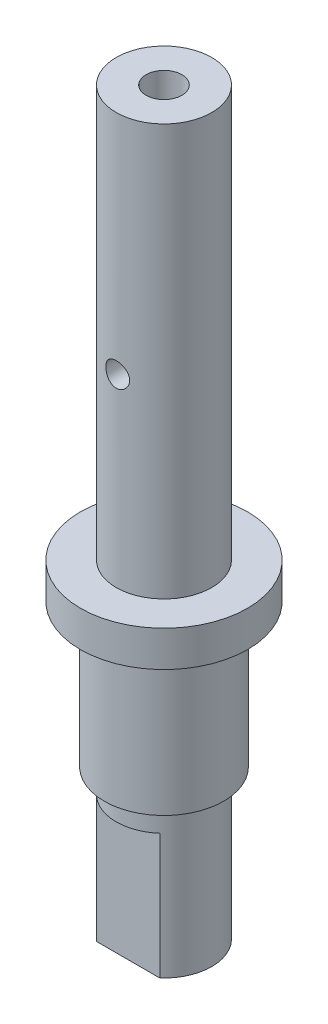
ISO-10303-21;
HEADER;
FILE_DESCRIPTION(('STEP AP214'),'2;1');
FILE_NAME('part.step','',(''),(''),'','','');
FILE_SCHEMA(('AUTOMOTIVE_DESIGN { 1 0 10303 214 1 1 1 1 }'));
ENDSEC;
DATA;
#1=APPLICATION_CONTEXT('core data for automotive mechanical design processes');
#2=APPLICATION_PROTOCOL_DEFINITION('international standard','automotive_design',2000,#1);
#3=PRODUCT_CONTEXT('',#1,'mechanical');
#4=PRODUCT('Part','Part','',(#3));
#5=PRODUCT_RELATED_PRODUCT_CATEGORY('part','',(#4));
#6=PRODUCT_DEFINITION_FORMATION('','',#4);
#7=PRODUCT_DEFINITION_CONTEXT('part definition',#1,'design');
#8=PRODUCT_DEFINITION('design','',#6,#7);
#9=PRODUCT_DEFINITION_SHAPE('','',#8);
#10=(LENGTH_UNIT() NAMED_UNIT(*) SI_UNIT(.MILLI.,.METRE.));
#11=(NAMED_UNIT(*) PLANE_ANGLE_UNIT() SI_UNIT($,.RADIAN.));
#12=(NAMED_UNIT(*) SI_UNIT($,.STERADIAN.) SOLID_ANGLE_UNIT());
#13=UNCERTAINTY_MEASURE_WITH_UNIT(LENGTH_MEASURE(1.E-05),#10,'distance_accuracy_value','');
#14=(GEOMETRIC_REPRESENTATION_CONTEXT(3) GLOBAL_UNCERTAINTY_ASSIGNED_CONTEXT((#13)) GLOBAL_UNIT_ASSIGNED_CONTEXT((#10,
#11,#12)) REPRESENTATION_CONTEXT('',''));
#15=CARTESIAN_POINT('',(0.,0.,0.));
#16=DIRECTION('',(0.,0.,1.));
#17=DIRECTION('',(1.,0.,0.));
#18=AXIS2_PLACEMENT_3D('',#15,#16,#17);
#19=CARTESIAN_POINT('',(0.,39.8,0.));
#20=DIRECTION('',(0.,-1.,0.));
#21=DIRECTION('',(0.,0.,-1.));
#22=AXIS2_PLACEMENT_3D('',#19,#20,#21);
#23=CYLINDRICAL_SURFACE('',#22,4.);
#24=CARTESIAN_POINT('',(0.,27.5,0.));
#25=DIRECTION('',(0.,1.,0.));
#26=DIRECTION('',(0.,0.,1.));
#27=AXIS2_PLACEMENT_3D('',#24,#25,#26);
#28=CIRCLE('',#27,4.);
#29=CARTESIAN_POINT('',(0.,27.5,4.));
#30=VERTEX_POINT('',#29);
#31=EDGE_CURVE('E74',#30,#30,#28,.T.);
#32=ORIENTED_EDGE('',*,*,#31,.T.);
#33=EDGE_LOOP('',(#32));
#34=FACE_BOUND('',#33,.T.);
#35=CARTESIAN_POINT('',(0.,61.963925,0.));
#36=DIRECTION('',(0.,1.,0.));
#37=DIRECTION('',(0.,0.,1.));
#38=AXIS2_PLACEMENT_3D('',#35,#36,#37);
#39=CIRCLE('',#38,4.);
#40=CARTESIAN_POINT('',(0.,61.963925,4.));
#41=VERTEX_POINT('',#40);
#42=EDGE_CURVE('E70',#41,#41,#39,.T.);
#43=ORIENTED_EDGE('',*,*,#42,.F.);
#44=EDGE_LOOP('',(#43));
#45=FACE_BOUND('',#44,.T.);
#46=CARTESIAN_POINT('',(-0.999999999999999,42.963925,3.87298334620742));
#47=CARTESIAN_POINT('',(-0.999998431438698,42.9087046996432,3.87298440057185));
#48=CARTESIAN_POINT('',(-0.995410498208068,42.8534670405686,3.87417722499278));
#49=CARTESIAN_POINT('',(-0.977209250194446,42.7445779687674,3.87880744892249));
#50=CARTESIAN_POINT('',(-0.963590682698078,42.69092749822,3.8822461547418));
#51=CARTESIAN_POINT('',(-0.927796479849635,42.5868035847122,3.89095489813012));
#52=CARTESIAN_POINT('',(-0.905631891140942,42.5363261378422,3.8962225706936));
#53=CARTESIAN_POINT('',(-0.853408456505405,42.4398006589875,3.90799276818327));
#54=CARTESIAN_POINT('',(-0.823349275424504,42.3937528151688,3.91449534553241));
#55=CARTESIAN_POINT('',(-0.755483370924518,42.3063803418942,3.92816286540368));
#56=CARTESIAN_POINT('',(-0.717534755081559,42.2651675598597,3.93533839048709));
#57=CARTESIAN_POINT('',(-0.635272825640329,42.1896204422561,3.94945150206622));
#58=CARTESIAN_POINT('',(-0.590958917672139,42.1552867497514,3.95638906626691));
#59=CARTESIAN_POINT('',(-0.496458080431564,42.0940148129474,3.96936166208095));
#60=CARTESIAN_POINT('',(-0.446197830478043,42.0671864447354,3.975382749602));
#61=CARTESIAN_POINT('',(-0.34170527371711,42.0224011423388,3.9857232477043));
#62=CARTESIAN_POINT('',(-0.287473554316778,42.0044428992338,3.99004290933747));
#63=CARTESIAN_POINT('',(-0.177743503501665,41.9782658661686,3.99641903539262));
#64=CARTESIAN_POINT('',(-0.122293087819592,41.9698571422694,3.99851957537723));
#65=CARTESIAN_POINT('',(-0.0107315277051112,41.9624216482898,4.00037437642922));
#66=CARTESIAN_POINT('',(0.0453795178152241,41.9633934911162,4.00012898438682));
#67=CARTESIAN_POINT('',(0.155352247172384,41.9745549401001,3.99735237981413));
#68=CARTESIAN_POINT('',(0.209236215601063,41.9845395300215,3.99487200936349));
#69=CARTESIAN_POINT('',(0.314538247413683,42.0131135080194,3.98796334609942));
#70=CARTESIAN_POINT('',(0.365956179370436,42.031703354151,3.98353494959376));
#71=CARTESIAN_POINT('',(0.465406703501805,42.0771260282748,3.97315003880358));
#72=CARTESIAN_POINT('',(0.513404509766502,42.1040318178647,3.96718007878021));
#73=CARTESIAN_POINT('',(0.604275622340485,42.1652672716465,3.9543596152386));
#74=CARTESIAN_POINT('',(0.647148035085503,42.1995982274242,3.94750895860996));
#75=CARTESIAN_POINT('',(0.727774035084955,42.2758084967929,3.93345485507808));
#76=CARTESIAN_POINT('',(0.765357679075198,42.3178669569391,3.92624687810367));
#77=CARTESIAN_POINT('',(0.832976375963017,42.4077649894161,3.91246017406682));
#78=CARTESIAN_POINT('',(0.863011076046014,42.4556048317964,3.90588147642388));
#79=CARTESIAN_POINT('',(0.914788129022598,42.5560410136596,3.89408198732659));
#80=CARTESIAN_POINT('',(0.936489566970494,42.6086592921253,3.88886793490288));
#81=CARTESIAN_POINT('',(0.970685620636344,42.7169591872306,3.88047456055983));
#82=CARTESIAN_POINT('',(0.983182206552912,42.7726401455933,3.87729480324087));
#83=CARTESIAN_POINT('',(0.998331855466071,42.8839088006092,3.87342142415656));
#84=CARTESIAN_POINT('',(1.00123618956785,42.9394601173318,3.87266435637459));
#85=CARTESIAN_POINT('',(0.99780679620622,43.0502537746313,3.87354937392416));
#86=CARTESIAN_POINT('',(0.991473919139522,43.1054961431805,3.87519123840506));
#87=CARTESIAN_POINT('',(0.969970185575067,43.2131707059819,3.88062832781824));
#88=CARTESIAN_POINT('',(0.9549456273127,43.2656340906283,3.8843878809375));
#89=CARTESIAN_POINT('',(0.91664723266825,43.3672975831407,3.89360287308385));
#90=CARTESIAN_POINT('',(0.893372419085019,43.4164973036221,3.89905851299445));
#91=CARTESIAN_POINT('',(0.838708267174625,43.5113015111469,3.91118454837305));
#92=CARTESIAN_POINT('',(0.807168701534254,43.5568165360172,3.91787667442657));
#93=CARTESIAN_POINT('',(0.737060292934457,43.6420003451205,3.93166833228686));
#94=CARTESIAN_POINT('',(0.698490294805439,43.68166816666,3.93876793091388));
#95=CARTESIAN_POINT('',(0.614262720984725,43.7550494170284,3.95278961212643));
#96=CARTESIAN_POINT('',(0.568451952531593,43.7885890250195,3.95970280824734));
#97=CARTESIAN_POINT('',(0.471702682694678,43.8474993467805,3.97238886645493));
#98=CARTESIAN_POINT('',(0.420764448957596,43.8728704866433,3.97816178801584));
#99=CARTESIAN_POINT('',(0.315558201731097,43.9145034138112,3.98788046295326));
#100=CARTESIAN_POINT('',(0.261317381027888,43.9308307137516,3.99183932008964));
#101=CARTESIAN_POINT('',(0.150749760318813,43.9541091338434,3.99754117358315));
#102=CARTESIAN_POINT('',(0.0944233650412474,43.9610620634956,3.99928459757363));
#103=CARTESIAN_POINT('',(-0.0170835264433233,43.9652925895755,4.00034169408811));
#104=CARTESIAN_POINT('',(-0.0722538269660297,43.9628267090954,3.99971978880008));
#105=CARTESIAN_POINT('',(-0.181367496414736,43.9488771727057,3.99625896457423));
#106=CARTESIAN_POINT('',(-0.235310901780882,43.9373937849869,3.99342011157094));
#107=CARTESIAN_POINT('',(-0.340171035644812,43.9058727802291,3.98585432853963));
#108=CARTESIAN_POINT('',(-0.391102494581015,43.8858815466854,3.98113764502669));
#109=CARTESIAN_POINT('',(-0.488917053041464,43.8379544209807,3.97031288913382));
#110=CARTESIAN_POINT('',(-0.535799641265047,43.8100175273304,3.96420464137727));
#111=CARTESIAN_POINT('',(-0.625401928423896,43.7462097660029,3.95107249681342));
#112=CARTESIAN_POINT('',(-0.667994988300582,43.7101648570926,3.94403016945647));
#113=CARTESIAN_POINT('',(-0.746615020271248,43.6315021480262,3.92990649053207));
#114=CARTESIAN_POINT('',(-0.782640325068175,43.5888826839021,3.92282512952424));
#115=CARTESIAN_POINT('',(-0.847762026479237,43.4973235857987,3.90927475860683));
#116=CARTESIAN_POINT('',(-0.876716619446589,43.4482808765875,3.90281963730391));
#117=CARTESIAN_POINT('',(-0.925926896615618,43.3458695100772,3.8914395555011));
#118=CARTESIAN_POINT('',(-0.946188909759554,43.2925040338927,3.88651348244814));
#119=CARTESIAN_POINT('',(-0.97442252856557,43.1933479881737,3.87951908741315));
#120=CARTESIAN_POINT('',(-0.983993170595827,43.1480318356176,3.87708663005761));
#121=CARTESIAN_POINT('',(-0.996782292572818,43.0564561309985,3.87381838580358));
#122=CARTESIAN_POINT('',(-1.00000131437052,43.0101966597494,3.87298246270639));
#123=CARTESIAN_POINT('',(-0.999999999999999,42.963925,3.87298334620742));
#124=B_SPLINE_CURVE_WITH_KNOTS('',3,(#46,#47,#48,#49,#50,#51,#52,#53,#54,#55,#56,#57,#58,#59,
#60,#61,#62,#63,#64,#65,#66,#67,#68,#69,#70,#71,#72,#73,#74,#75,#76,#77,#78,#79,#80,#81,#82,#83,
#84,#85,#86,#87,#88,#89,#90,#91,#92,#93,#94,#95,#96,#97,#98,#99,#100,#101,#102,#103,#104,#105,
#106,#107,#108,#109,#110,#111,#112,#113,#114,#115,#116,#117,#118,#119,#120,#121,#122,#123),
.UNSPECIFIED.,.T.,.F.,(4,2,2,2,2,2,2,2,2,2,2,2,2,2,2,2,2,2,2,2,2,2,2,2,2,2,2,2,2,2,2,2,2,2,2,2,
2,2,4),(0.,0.165490976675223,0.331078296534208,0.496452290829153,0.66183330698466,
0.830495816734646,0.999174085882211,1.17020598555442,1.34121263935111,1.50875500394413,
1.67627259462682,1.84007305071853,2.00388222686188,2.16917149698052,2.33448954183839,
2.50428186625039,2.67408212476195,2.84470572799636,3.01529280048094,3.18137429900961,
3.34744050869795,3.51078961999958,3.67415808564842,3.84073138339938,4.00733207550293,
4.17810132382402,4.34886166284095,4.51836829119046,4.6878421955989,4.85273378447257,
5.01762046947067,5.18161950620159,5.34563922291503,5.51358838629103,5.68158012622478,
5.85270590910145,6.02370688542922,6.16239130867207,6.30106390036083),.UNSPECIFIED.);
#125=CARTESIAN_POINT('',(-0.999999999999999,42.963925,3.87298334620742));
#126=VERTEX_POINT('',#125);
#127=EDGE_CURVE('E83',#126,#126,#124,.T.);
#128=ORIENTED_EDGE('',*,*,#127,.F.);
#129=EDGE_LOOP('',(#128));
#130=FACE_BOUND('',#129,.T.);
#131=CARTESIAN_POINT('',(0.,43.963925,-4.));
#132=CARTESIAN_POINT('',(0.055250725779821,43.9639234495079,-3.99999906578675));
#133=CARTESIAN_POINT('',(0.110518771887176,43.9593306328175,-3.99884385421219));
#134=CARTESIAN_POINT('',(0.219470882513689,43.941108232462,-3.99434742553261));
#135=CARTESIAN_POINT('',(0.27315403124716,43.9274735269748,-3.99100496946646));
#136=CARTESIAN_POINT('',(0.37734724812172,43.8916321643586,-3.98250417554693));
#137=CARTESIAN_POINT('',(0.427861042286672,43.8694358008565,-3.97734801894724));
#138=CARTESIAN_POINT('',(0.524448087936288,43.8171374066368,-3.96576895871729));
#139=CARTESIAN_POINT('',(0.570521189565842,43.787035109254,-3.95934601236034));
#140=CARTESIAN_POINT('',(0.657867951533948,43.7191244735639,-3.94578275727868));
#141=CARTESIAN_POINT('',(0.699037126707383,43.6811839500272,-3.93863138099022));
#142=CARTESIAN_POINT('',(0.774499284802205,43.5989568633941,-3.92449080078353));
#143=CARTESIAN_POINT('',(0.808791491299426,43.5546695847023,-3.91750161525566));
#144=CARTESIAN_POINT('',(0.870017695199358,43.4601948488417,-3.9043651713314));
#145=CARTESIAN_POINT('',(0.896834810616906,43.4099295127931,-3.89823196313737));
#146=CARTESIAN_POINT('',(0.941597939033686,43.3054260588944,-3.88766329874815));
#147=CARTESIAN_POINT('',(0.95954537029289,43.2511885777828,-3.88322757115193));
#148=CARTESIAN_POINT('',(0.985703224536196,43.1414293345317,-3.87666984478367));
#149=CARTESIAN_POINT('',(0.994101512222228,43.0859550693001,-3.87450327383617));
#150=CARTESIAN_POINT('',(1.00150785004524,42.9743459539907,-3.8725957502516));
#151=CARTESIAN_POINT('',(1.00051742787865,42.9182112128676,-3.87285440299096));
#152=CARTESIAN_POINT('',(0.989324349759521,42.8083144615037,-3.87572803664412));
#153=CARTESIAN_POINT('',(0.979345560127014,42.7545279190233,-3.87828575334586));
#154=CARTESIAN_POINT('',(0.950816124602071,42.6494176327258,-3.88537806450989));
#155=CARTESIAN_POINT('',(0.932264868046283,42.5980940646473,-3.88991279980464));
#156=CARTESIAN_POINT('',(0.88692631862477,42.4987663224986,-3.90050075936124));
#157=CARTESIAN_POINT('',(0.860057778155274,42.4508008854736,-3.90656884979614));
#158=CARTESIAN_POINT('',(0.798904184009969,42.3599791934954,-3.91953140564257));
#159=CARTESIAN_POINT('',(0.764617832539225,42.3171238346218,-3.9264260155649));
#160=CARTESIAN_POINT('',(0.68844228312081,42.2364559228704,-3.94050587026521));
#161=CARTESIAN_POINT('',(0.646364172110572,42.1988220066258,-3.94769379651981));
#162=CARTESIAN_POINT('',(0.556407945002466,42.1311108383574,-3.96137310385857));
#163=CARTESIAN_POINT('',(0.508529651805295,42.1010338171576,-3.96786446366277));
#164=CARTESIAN_POINT('',(0.408077259120927,42.0492246091837,-3.97945154729455));
#165=CARTESIAN_POINT('',(0.355487595472416,42.0275214398304,-3.9845424008515));
#166=CARTESIAN_POINT('',(0.247250672095256,41.9933134628603,-3.99271944660946));
#167=CARTESIAN_POINT('',(0.191603999433656,41.9808068957212,-3.99580602226187));
#168=CARTESIAN_POINT('',(0.0803599802600171,41.9656199562941,-3.9995699951425));
#169=CARTESIAN_POINT('',(0.0247978133254725,41.9626963159498,-4.00030702338852));
#170=CARTESIAN_POINT('',(-0.0860219165343391,41.9660910013703,-3.999458698763));
#171=CARTESIAN_POINT('',(-0.14127950642973,41.9724084951994,-3.99787355494564));
#172=CARTESIAN_POINT('',(-0.249076179184328,41.9939056055943,-3.99259720751571));
#173=CARTESIAN_POINT('',(-0.301643412645837,42.0089525089847,-3.98893756123874));
#174=CARTESIAN_POINT('',(-0.403504861635007,42.0473297226856,-3.97992471089423));
#175=CARTESIAN_POINT('',(-0.452798746021756,42.0706608695421,-3.97457133579928));
#176=CARTESIAN_POINT('',(-0.547682089619897,42.1254157525831,-3.96262205284207));
#177=CARTESIAN_POINT('',(-0.593190294557219,42.1569757415978,-3.95600578244621));
#178=CARTESIAN_POINT('',(-0.678351075762163,42.2271182725313,-3.94229672791613));
#179=CARTESIAN_POINT('',(-0.718002639315338,42.2657020264113,-3.93520386167803));
#180=CARTESIAN_POINT('',(-0.79132704538182,42.3499263072296,-3.92112637973847));
#181=CARTESIAN_POINT('',(-0.824829245081353,42.3957168020016,-3.91414869458187));
#182=CARTESIAN_POINT('',(-0.883673839341797,42.4924134229771,-3.90128585584826));
#183=CARTESIAN_POINT('',(-0.909016596105291,42.5433193219732,-3.89540065378017));
#184=CARTESIAN_POINT('',(-0.950634280406194,42.648528814942,-3.88545396489777));
#185=CARTESIAN_POINT('',(-0.966962931102708,42.7028100855627,-3.88138170194604));
#186=CARTESIAN_POINT('',(-0.990230439969183,42.8134647585927,-3.87551162726789));
#187=CARTESIAN_POINT('',(-0.997171351652437,42.8698377006883,-3.87371331813291));
#188=CARTESIAN_POINT('',(-1.00135906022266,42.9813390159035,-3.87263267469304));
#189=CARTESIAN_POINT('',(-0.998878598520079,43.0364566234165,-3.87327955152176));
#190=CARTESIAN_POINT('',(-0.984918185541912,43.1454609257786,-3.87685272671895));
#191=CARTESIAN_POINT('',(-0.973438415124513,43.1993476453424,-3.87977897927904));
#192=CARTESIAN_POINT('',(-0.941954212961864,43.3040639727103,-3.88754173788482));
#193=CARTESIAN_POINT('',(-0.922000936453586,43.3549098701601,-3.89236676824206));
#194=CARTESIAN_POINT('',(-0.874176609070049,43.4525685884758,-3.90338503816552));
#195=CARTESIAN_POINT('',(-0.846304460022793,43.4993808487913,-3.90957846747182));
#196=CARTESIAN_POINT('',(-0.782578499091422,43.5889614193347,-3.92283756175675));
#197=CARTESIAN_POINT('',(-0.746535441941501,43.6315923822826,-3.92992176554505));
#198=CARTESIAN_POINT('',(-0.667859580793154,43.7102896965303,-3.94405351497524));
#199=CARTESIAN_POINT('',(-0.625225214174095,43.746354486742,-3.95110105151373));
#200=CARTESIAN_POINT('',(-0.533645057801724,43.8115325390431,-3.96451770431775));
#201=CARTESIAN_POINT('',(-0.484598948210921,43.8405080757811,-3.97087222243912));
#202=CARTESIAN_POINT('',(-0.38217737300698,43.8897566419604,-3.98203283316746));
#203=CARTESIAN_POINT('',(-0.328805042291157,43.910035907099,-3.98684003466521));
#204=CARTESIAN_POINT('',(-0.229606835495646,43.9383062202198,-3.99365373043694));
#205=CARTESIAN_POINT('',(-0.184253447272044,43.947892495369,-3.9960172336846));
#206=CARTESIAN_POINT('',(-0.0926040476908548,43.960702295748,-3.99919070154632));
#207=CARTESIAN_POINT('',(-0.0463081074950773,43.9639262995369,-4.00000078300596));
#208=CARTESIAN_POINT('',(0.,43.963925,-4.));
#209=B_SPLINE_CURVE_WITH_KNOTS('',3,(#131,#132,#133,#134,#135,#136,#137,#138,#139,#140,#141,
#142,#143,#144,#145,#146,#147,#148,#149,#150,#151,#152,#153,#154,#155,#156,#157,#158,#159,#160,
#161,#162,#163,#164,#165,#166,#167,#168,#169,#170,#171,#172,#173,#174,#175,#176,#177,#178,#179,
#180,#181,#182,#183,#184,#185,#186,#187,#188,#189,#190,#191,#192,#193,#194,#195,#196,#197,#198,
#199,#200,#201,#202,#203,#204,#205,#206,#207,#208),.UNSPECIFIED.,.T.,.F.,(4,2,2,2,2,2,2,2,2,2,2,
2,2,2,2,2,2,2,2,2,2,2,2,2,2,2,2,2,2,2,2,2,2,2,2,2,2,2,4),(0.,0.165582474981261,
0.331258825175935,0.496736601524073,0.662219960112887,0.830762902914266,0.999324863867081,
1.17039098363872,1.34142974112912,1.50904196732954,1.67662692075132,1.84014998004679,
2.00368468977359,2.16887018582587,2.33408460557443,2.50401000646013,2.67394059705498,
2.84445486006076,3.01493649125762,3.18105539299518,3.34715934075162,3.51080183009358,
3.67446084881527,3.84102391710234,4.00761575338679,4.17829672802984,4.34897012499672,
4.51861503076024,4.68822282168271,4.85295853599074,5.01769093970689,5.18144267039631,
5.34521712091267,5.51326384273274,5.68135046513612,5.85248123666392,6.02348909214234,
6.16228161961433,6.3010637069536),.UNSPECIFIED.);
#210=CARTESIAN_POINT('',(0.,43.963925,-4.));
#211=VERTEX_POINT('',#210);
#212=EDGE_CURVE('E36',#211,#211,#209,.T.);
#213=ORIENTED_EDGE('',*,*,#212,.F.);
#214=EDGE_LOOP('',(#213));
#215=FACE_BOUND('',#214,.T.);
#216=ADVANCED_FACE('F32',(#34,#45,#130,#215),#23,.T.);
#217=CARTESIAN_POINT('',(0.,12.5,0.));
#218=DIRECTION('',(0.,-1.,0.));
#219=DIRECTION('',(0.,0.,-1.));
#220=AXIS2_PLACEMENT_3D('',#217,#218,#219);
#221=CYLINDRICAL_SURFACE('',#220,4.);
#222=CARTESIAN_POINT('',(0.,12.5,0.));
#223=DIRECTION('',(0.,1.,0.));
#224=DIRECTION('',(0.,0.,1.));
#225=AXIS2_PLACEMENT_3D('',#222,#223,#224);
#226=CIRCLE('',#225,4.);
#227=CARTESIAN_POINT('',(0.,12.5,4.));
#228=VERTEX_POINT('',#227);
#229=EDGE_CURVE('E11',#228,#228,#226,.T.);
#230=ORIENTED_EDGE('',*,*,#229,.F.);
#231=EDGE_LOOP('',(#230));
#232=FACE_BOUND('',#231,.T.);
#233=CARTESIAN_POINT('',(0.,10.5,0.));
#234=DIRECTION('',(0.,-1.,0.));
#235=DIRECTION('',(0.,0.,-1.));
#236=AXIS2_PLACEMENT_3D('',#233,#234,#235);
#237=CIRCLE('',#236,4.);
#238=CARTESIAN_POINT('',(2.64575131106459,10.5,3.));
#239=VERTEX_POINT('',#238);
#240=CARTESIAN_POINT('',(-2.64575131106459,10.5,3.));
#241=VERTEX_POINT('',#240);
#242=EDGE_CURVE('E69',#239,#241,#237,.T.);
#243=ORIENTED_EDGE('',*,*,#242,.F.);
#244=DIRECTION('',(0.,-1.,0.));
#245=VECTOR('',#244,1.);
#246=CARTESIAN_POINT('',(2.64575131106459,10.5,3.));
#247=LINE('',#246,#245);
#248=CARTESIAN_POINT('',(2.64575131106459,0.,3.));
#249=VERTEX_POINT('',#248);
#250=EDGE_CURVE('E59',#239,#249,#247,.T.);
#251=ORIENTED_EDGE('',*,*,#250,.T.);
#252=CARTESIAN_POINT('',(0.,0.,0.));
#253=DIRECTION('',(0.,1.,0.));
#254=DIRECTION('',(0.,0.,1.));
#255=AXIS2_PLACEMENT_3D('',#252,#253,#254);
#256=CIRCLE('',#255,4.);
#257=CARTESIAN_POINT('',(-2.64575131106459,0.,3.));
#258=VERTEX_POINT('',#257);
#259=EDGE_CURVE('E45',#249,#258,#256,.T.);
#260=ORIENTED_EDGE('',*,*,#259,.T.);
#261=DIRECTION('',(0.,-1.,0.));
#262=VECTOR('',#261,1.);
#263=CARTESIAN_POINT('',(-2.64575131106459,10.5,3.));
#264=LINE('',#263,#262);
#265=EDGE_CURVE('E53',#241,#258,#264,.T.);
#266=ORIENTED_EDGE('',*,*,#265,.F.);
#267=EDGE_LOOP('',(#243,#251,#260,#266));
#268=FACE_BOUND('',#267,.T.);
#269=ADVANCED_FACE('F34',(#232,#268),#221,.T.);
#270=CARTESIAN_POINT('',(0.,0.,0.));
#271=DIRECTION('',(0.,1.,0.));
#272=DIRECTION('',(0.,0.,1.));
#273=AXIS2_PLACEMENT_3D('',#270,#271,#272);
#274=PLANE('',#273);
#275=ORIENTED_EDGE('',*,*,#259,.F.);
#276=DIRECTION('',(1.,0.,0.));
#277=VECTOR('',#276,1.);
#278=CARTESIAN_POINT('',(-2.64575131106459,0.,3.));
#279=LINE('',#278,#277);
#280=EDGE_CURVE('E64',#258,#249,#279,.T.);
#281=ORIENTED_EDGE('',*,*,#280,.F.);
#282=EDGE_LOOP('',(#275,#281));
#283=FACE_BOUND('',#282,.T.);
#284=ADVANCED_FACE('F76',(#283),#274,.F.);
#285=CARTESIAN_POINT('',(0.,24.5,0.));
#286=DIRECTION('',(0.,-1.,0.));
#287=DIRECTION('',(0.,0.,-1.));
#288=AXIS2_PLACEMENT_3D('',#285,#286,#287);
#289=CYLINDRICAL_SURFACE('',#288,5.);
#290=CARTESIAN_POINT('',(0.,24.5,0.));
#291=DIRECTION('',(0.,1.,0.));
#292=DIRECTION('',(0.,0.,1.));
#293=AXIS2_PLACEMENT_3D('',#290,#291,#292);
#294=CIRCLE('',#293,5.);
#295=CARTESIAN_POINT('',(0.,24.5,5.));
#296=VERTEX_POINT('',#295);
#297=EDGE_CURVE('E77',#296,#296,#294,.T.);
#298=ORIENTED_EDGE('',*,*,#297,.F.);
#299=EDGE_LOOP('',(#298));
#300=FACE_BOUND('',#299,.T.);
#301=CARTESIAN_POINT('',(0.,12.5,0.));
#302=DIRECTION('',(0.,1.,0.));
#303=DIRECTION('',(0.,0.,1.));
#304=AXIS2_PLACEMENT_3D('',#301,#302,#303);
#305=CIRCLE('',#304,5.);
#306=CARTESIAN_POINT('',(0.,12.5,5.));
#307=VERTEX_POINT('',#306);
#308=EDGE_CURVE('E80',#307,#307,#305,.T.);
#309=ORIENTED_EDGE('',*,*,#308,.T.);
#310=EDGE_LOOP('',(#309));
#311=FACE_BOUND('',#310,.T.);
#312=ADVANCED_FACE('F159',(#300,#311),#289,.T.);
#313=CARTESIAN_POINT('',(0.,12.5,0.));
#314=DIRECTION('',(0.,1.,0.));
#315=DIRECTION('',(0.,0.,1.));
#316=AXIS2_PLACEMENT_3D('',#313,#314,#315);
#317=PLANE('',#316);
#318=ORIENTED_EDGE('',*,*,#229,.T.);
#319=EDGE_LOOP('',(#318));
#320=FACE_BOUND('',#319,.T.);
#321=ORIENTED_EDGE('',*,*,#308,.F.);
#322=EDGE_LOOP('',(#321));
#323=FACE_BOUND('',#322,.T.);
#324=ADVANCED_FACE('F161',(#320,#323),#317,.F.);
#325=CARTESIAN_POINT('',(0.,27.5,0.));
#326=DIRECTION('',(0.,-1.,0.));
#327=DIRECTION('',(0.,0.,-1.));
#328=AXIS2_PLACEMENT_3D('',#325,#326,#327);
#329=CYLINDRICAL_SURFACE('',#328,7.);
#330=CARTESIAN_POINT('',(0.,27.5,0.));
#331=DIRECTION('',(0.,1.,0.));
#332=DIRECTION('',(0.,0.,1.));
#333=AXIS2_PLACEMENT_3D('',#330,#331,#332);
#334=CIRCLE('',#333,7.);
#335=CARTESIAN_POINT('',(0.,27.5,7.));
#336=VERTEX_POINT('',#335);
#337=EDGE_CURVE('E152',#336,#336,#334,.T.);
#338=ORIENTED_EDGE('',*,*,#337,.F.);
#339=EDGE_LOOP('',(#338));
#340=FACE_BOUND('',#339,.T.);
#341=CARTESIAN_POINT('',(0.,24.5,0.));
#342=DIRECTION('',(0.,1.,0.));
#343=DIRECTION('',(0.,0.,1.));
#344=AXIS2_PLACEMENT_3D('',#341,#342,#343);
#345=CIRCLE('',#344,7.);
#346=CARTESIAN_POINT('',(0.,24.5,7.));
#347=VERTEX_POINT('',#346);
#348=EDGE_CURVE('E151',#347,#347,#345,.T.);
#349=ORIENTED_EDGE('',*,*,#348,.T.);
#350=EDGE_LOOP('',(#349));
#351=FACE_BOUND('',#350,.T.);
#352=ADVANCED_FACE('F163',(#340,#351),#329,.T.);
#353=CARTESIAN_POINT('',(0.,27.5,0.));
#354=DIRECTION('',(0.,1.,0.));
#355=DIRECTION('',(0.,0.,1.));
#356=AXIS2_PLACEMENT_3D('',#353,#354,#355);
#357=PLANE('',#356);
#358=ORIENTED_EDGE('',*,*,#31,.F.);
#359=EDGE_LOOP('',(#358));
#360=FACE_BOUND('',#359,.T.);
#361=ORIENTED_EDGE('',*,*,#337,.T.);
#362=EDGE_LOOP('',(#361));
#363=FACE_BOUND('',#362,.T.);
#364=ADVANCED_FACE('F116',(#360,#363),#357,.T.);
#365=CARTESIAN_POINT('',(0.,24.5,0.));
#366=DIRECTION('',(0.,1.,0.));
#367=DIRECTION('',(0.,0.,1.));
#368=AXIS2_PLACEMENT_3D('',#365,#366,#367);
#369=PLANE('',#368);
#370=ORIENTED_EDGE('',*,*,#297,.T.);
#371=EDGE_LOOP('',(#370));
#372=FACE_BOUND('',#371,.T.);
#373=ORIENTED_EDGE('',*,*,#348,.F.);
#374=EDGE_LOOP('',(#373));
#375=FACE_BOUND('',#374,.T.);
#376=ADVANCED_FACE('F112',(#372,#375),#369,.F.);
#377=CARTESIAN_POINT('',(-2.64575131106459,10.5,3.));
#378=DIRECTION('',(0.,0.,-1.));
#379=DIRECTION('',(-1.,0.,0.));
#380=AXIS2_PLACEMENT_3D('',#377,#378,#379);
#381=PLANE('',#380);
#382=ORIENTED_EDGE('',*,*,#280,.T.);
#383=ORIENTED_EDGE('',*,*,#250,.F.);
#384=DIRECTION('',(1.,0.,0.));
#385=VECTOR('',#384,1.);
#386=CARTESIAN_POINT('',(-2.64575131106459,10.5,3.));
#387=LINE('',#386,#385);
#388=EDGE_CURVE('E147',#241,#239,#387,.T.);
#389=ORIENTED_EDGE('',*,*,#388,.F.);
#390=ORIENTED_EDGE('',*,*,#265,.T.);
#391=EDGE_LOOP('',(#382,#383,#389,#390));
#392=FACE_BOUND('',#391,.T.);
#393=ADVANCED_FACE('F65',(#392),#381,.F.);
#394=CARTESIAN_POINT('',(0.,10.5,0.));
#395=DIRECTION('',(0.,-1.,0.));
#396=DIRECTION('',(0.,0.,-1.));
#397=AXIS2_PLACEMENT_3D('',#394,#395,#396);
#398=PLANE('',#397);
#399=ORIENTED_EDGE('',*,*,#242,.T.);
#400=ORIENTED_EDGE('',*,*,#388,.T.);
#401=EDGE_LOOP('',(#399,#400));
#402=FACE_BOUND('',#401,.T.);
#403=ADVANCED_FACE('F107',(#402),#398,.T.);
#404=CARTESIAN_POINT('',(0.,61.963925,0.));
#405=DIRECTION('',(0.,1.,0.));
#406=DIRECTION('',(0.,0.,1.));
#407=AXIS2_PLACEMENT_3D('',#404,#405,#406);
#408=PLANE('',#407);
#409=CARTESIAN_POINT('',(0.,61.963925,0.));
#410=DIRECTION('',(0.,1.,0.));
#411=DIRECTION('',(0.,0.,1.));
#412=AXIS2_PLACEMENT_3D('',#409,#410,#411);
#413=CIRCLE('',#412,1.5);
#414=CARTESIAN_POINT('',(0.,61.963925,1.5));
#415=VERTEX_POINT('',#414);
#416=EDGE_CURVE('E136',#415,#415,#413,.T.);
#417=ORIENTED_EDGE('',*,*,#416,.F.);
#418=EDGE_LOOP('',(#417));
#419=FACE_BOUND('',#418,.T.);
#420=ORIENTED_EDGE('',*,*,#42,.T.);
#421=EDGE_LOOP('',(#420));
#422=FACE_BOUND('',#421,.T.);
#423=ADVANCED_FACE('F103',(#419,#422),#408,.T.);
#424=CARTESIAN_POINT('',(0.,53.963925,0.));
#425=DIRECTION('',(0.,1.,0.));
#426=DIRECTION('',(0.,0.,1.));
#427=AXIS2_PLACEMENT_3D('',#424,#425,#426);
#428=CYLINDRICAL_SURFACE('',#427,1.5);
#429=CARTESIAN_POINT('',(0.,53.963925,0.));
#430=DIRECTION('',(0.,1.,0.));
#431=DIRECTION('',(0.,0.,1.));
#432=AXIS2_PLACEMENT_3D('',#429,#430,#431);
#433=CIRCLE('',#432,1.5);
#434=CARTESIAN_POINT('',(0.,53.963925,1.5));
#435=VERTEX_POINT('',#434);
#436=EDGE_CURVE('E138',#435,#435,#433,.T.);
#437=ORIENTED_EDGE('',*,*,#436,.F.);
#438=EDGE_LOOP('',(#437));
#439=FACE_BOUND('',#438,.T.);
#440=ORIENTED_EDGE('',*,*,#416,.T.);
#441=EDGE_LOOP('',(#440));
#442=FACE_BOUND('',#441,.T.);
#443=ADVANCED_FACE('F99',(#439,#442),#428,.F.);
#444=CARTESIAN_POINT('',(0.,53.963925,0.));
#445=DIRECTION('',(0.,1.,0.));
#446=DIRECTION('',(0.,0.,1.));
#447=AXIS2_PLACEMENT_3D('',#444,#445,#446);
#448=PLANE('',#447);
#449=ORIENTED_EDGE('',*,*,#436,.T.);
#450=EDGE_LOOP('',(#449));
#451=FACE_BOUND('',#450,.T.);
#452=ADVANCED_FACE('F94',(#451),#448,.T.);
#453=CARTESIAN_POINT('',(0.,42.963925,23.));
#454=DIRECTION('',(0.,0.,-1.));
#455=DIRECTION('',(-1.,0.,0.));
#456=AXIS2_PLACEMENT_3D('',#453,#454,#455);
#457=CYLINDRICAL_SURFACE('',#456,1.);
#458=ORIENTED_EDGE('',*,*,#127,.T.);
#459=EDGE_LOOP('',(#458));
#460=FACE_BOUND('',#459,.T.);
#461=ORIENTED_EDGE('',*,*,#212,.T.);
#462=EDGE_LOOP('',(#461));
#463=FACE_BOUND('',#462,.T.);
#464=ADVANCED_FACE('F90',(#460,#463),#457,.F.);
#465=CLOSED_SHELL('',(#216,#269,#284,#312,#324,#352,#364,#376,#393,#403,#423,#443,#452,#464));
#466=MANIFOLD_SOLID_BREP('B2',#465);
#467=ADVANCED_BREP_SHAPE_REPRESENTATION('',(#18,#466),#14);
#468=SHAPE_DEFINITION_REPRESENTATION(#9,#467);
ENDSEC;
END-ISO-10303-21;
